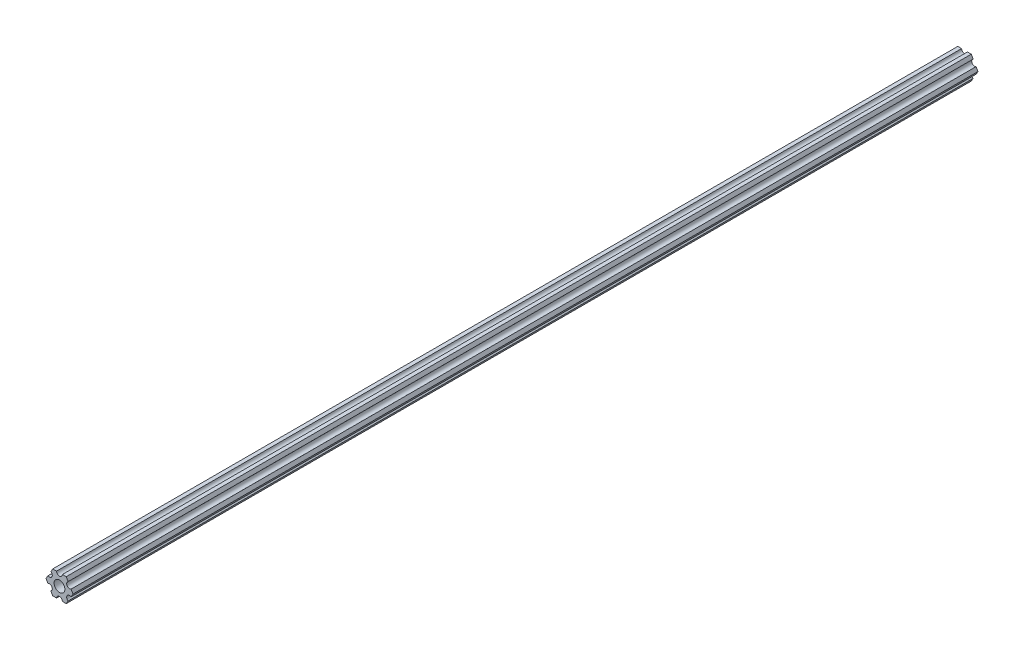
ISO-10303-21;
HEADER;
FILE_DESCRIPTION(('STEP AP214'),'2;1');
FILE_NAME('part.step','',(''),(''),'','','');
FILE_SCHEMA(('AUTOMOTIVE_DESIGN { 1 0 10303 214 1 1 1 1 }'));
ENDSEC;
DATA;
#1=APPLICATION_CONTEXT('core data for automotive mechanical design processes');
#2=APPLICATION_PROTOCOL_DEFINITION('international standard','automotive_design',2000,#1);
#3=PRODUCT_CONTEXT('',#1,'mechanical');
#4=PRODUCT('Part','Part','',(#3));
#5=PRODUCT_RELATED_PRODUCT_CATEGORY('part','',(#4));
#6=PRODUCT_DEFINITION_FORMATION('','',#4);
#7=PRODUCT_DEFINITION_CONTEXT('part definition',#1,'design');
#8=PRODUCT_DEFINITION('design','',#6,#7);
#9=PRODUCT_DEFINITION_SHAPE('','',#8);
#10=(LENGTH_UNIT() NAMED_UNIT(*) SI_UNIT(.MILLI.,.METRE.));
#11=(NAMED_UNIT(*) PLANE_ANGLE_UNIT() SI_UNIT($,.RADIAN.));
#12=(NAMED_UNIT(*) SI_UNIT($,.STERADIAN.) SOLID_ANGLE_UNIT());
#13=UNCERTAINTY_MEASURE_WITH_UNIT(LENGTH_MEASURE(1.E-05),#10,'distance_accuracy_value','');
#14=(GEOMETRIC_REPRESENTATION_CONTEXT(3) GLOBAL_UNCERTAINTY_ASSIGNED_CONTEXT((#13)) GLOBAL_UNIT_ASSIGNED_CONTEXT((#10,
#11,#12)) REPRESENTATION_CONTEXT('',''));
#15=CARTESIAN_POINT('',(0.,0.,0.));
#16=DIRECTION('',(0.,0.,1.));
#17=DIRECTION('',(1.,0.,0.));
#18=AXIS2_PLACEMENT_3D('',#15,#16,#17);
#19=CARTESIAN_POINT('',(6.29301142309098,-1.80018429024546,85.725));
#20=DIRECTION('',(-0.866025434075723,0.499999947533953,0.));
#21=DIRECTION('',(0.,0.,1.));
#22=AXIS2_PLACEMENT_3D('',#19,#20,#21);
#23=PLANE('',#22);
#24=DIRECTION('',(0.,0.,1.));
#25=VECTOR('',#24,1.);
#26=CARTESIAN_POINT('',(7.33234841870827,4.44212519169686E-07,85.725));
#27=LINE('',#26,#25);
#28=CARTESIAN_POINT('',(7.33234841870826,4.44212518961143E-07,-406.4));
#29=VERTEX_POINT('',#28);
#30=CARTESIAN_POINT('',(7.33234841870826,4.44212519315656E-07,85.725));
#31=VERTEX_POINT('',#30);
#32=EDGE_CURVE('E11',#29,#31,#27,.T.);
#33=ORIENTED_EDGE('',*,*,#32,.T.);
#34=DIRECTION('',(0.499999947533953,0.866025434075723,0.));
#35=VECTOR('',#34,1.);
#36=CARTESIAN_POINT('',(6.29301142309098,-1.80018429024546,85.725));
#37=LINE('',#36,#35);
#38=CARTESIAN_POINT('',(6.29301142309098,-1.80018429024546,85.725));
#39=VERTEX_POINT('',#38);
#40=EDGE_CURVE('E339',#39,#31,#37,.T.);
#41=ORIENTED_EDGE('',*,*,#40,.F.);
#42=DIRECTION('',(0.,0.,-1.));
#43=VECTOR('',#42,1.);
#44=CARTESIAN_POINT('',(6.29301142309098,-1.80018429024546,85.725));
#45=LINE('',#44,#43);
#46=CARTESIAN_POINT('',(6.29301142309098,-1.80018429024546,-406.4));
#47=VERTEX_POINT('',#46);
#48=EDGE_CURVE('E338',#39,#47,#45,.T.);
#49=ORIENTED_EDGE('',*,*,#48,.T.);
#50=DIRECTION('',(-0.499999947533953,-0.866025434075723,0.));
#51=VECTOR('',#50,1.);
#52=CARTESIAN_POINT('',(6.29301142309098,-1.80018429024546,-406.4));
#53=LINE('',#52,#51);
#54=EDGE_CURVE('E255',#29,#47,#53,.T.);
#55=ORIENTED_EDGE('',*,*,#54,.F.);
#56=EDGE_LOOP('',(#33,#41,#49,#55));
#57=FACE_BOUND('',#56,.T.);
#58=ADVANCED_FACE('F51',(#57),#23,.F.);
#59=CARTESIAN_POINT('',(7.33234841870827,4.44212519169686E-07,85.725));
#60=DIRECTION('',(-0.866025373493145,-0.500000052466057,0.));
#61=DIRECTION('',(-0.500000052466057,0.866025373493145,0.));
#62=AXIS2_PLACEMENT_3D('',#59,#60,#61);
#63=PLANE('',#62);
#64=DIRECTION('',(0.,0.,1.));
#65=VECTOR('',#64,1.);
#66=CARTESIAN_POINT('',(6.29301120497139,1.80018505273894,85.725));
#67=LINE('',#66,#65);
#68=CARTESIAN_POINT('',(6.29301120497139,1.80018505273894,-406.4));
#69=VERTEX_POINT('',#68);
#70=CARTESIAN_POINT('',(6.29301120497139,1.80018505273894,85.725));
#71=VERTEX_POINT('',#70);
#72=EDGE_CURVE('E60',#69,#71,#67,.T.);
#73=ORIENTED_EDGE('',*,*,#72,.T.);
#74=DIRECTION('',(-0.500000052466057,0.866025373493145,0.));
#75=VECTOR('',#74,1.);
#76=CARTESIAN_POINT('',(7.33234841870827,4.44212519198906E-07,85.725));
#77=LINE('',#76,#75);
#78=EDGE_CURVE('E343',#31,#71,#77,.T.);
#79=ORIENTED_EDGE('',*,*,#78,.F.);
#80=ORIENTED_EDGE('',*,*,#32,.F.);
#81=DIRECTION('',(0.500000052466055,-0.866025373493145,0.));
#82=VECTOR('',#81,1.);
#83=CARTESIAN_POINT('',(7.33234841870826,4.44212518961143E-07,-406.4));
#84=LINE('',#83,#82);
#85=EDGE_CURVE('E249',#69,#29,#84,.T.);
#86=ORIENTED_EDGE('',*,*,#85,.F.);
#87=EDGE_LOOP('',(#73,#79,#80,#86));
#88=FACE_BOUND('',#87,.T.);
#89=ADVANCED_FACE('F250',(#88),#63,.F.);
#90=CARTESIAN_POINT('',(4.70551103839172,4.54981561357972,85.725));
#91=DIRECTION('',(-0.866025373493151,-0.500000052466046,0.));
#92=DIRECTION('',(-0.500000052466046,0.866025373493151,0.));
#93=AXIS2_PLACEMENT_3D('',#90,#91,#92);
#94=PLANE('',#93);
#95=DIRECTION('',(0.,0.,1.));
#96=VECTOR('',#95,1.);
#97=CARTESIAN_POINT('',(3.66617382465481,6.35000022210627,85.725));
#98=LINE('',#97,#96);
#99=CARTESIAN_POINT('',(3.66617382465481,6.35000022210627,-406.4));
#100=VERTEX_POINT('',#99);
#101=CARTESIAN_POINT('',(3.66617382465481,6.35000022210627,85.725));
#102=VERTEX_POINT('',#101);
#103=EDGE_CURVE('E246',#100,#102,#98,.T.);
#104=ORIENTED_EDGE('',*,*,#103,.T.);
#105=DIRECTION('',(-0.500000052466046,0.866025373493151,0.));
#106=VECTOR('',#105,1.);
#107=CARTESIAN_POINT('',(4.70551103839172,4.54981561357972,85.725));
#108=LINE('',#107,#106);
#109=CARTESIAN_POINT('',(4.70551103839172,4.54981561357972,85.725));
#110=VERTEX_POINT('',#109);
#111=EDGE_CURVE('E386',#110,#102,#108,.T.);
#112=ORIENTED_EDGE('',*,*,#111,.F.);
#113=DIRECTION('',(0.,0.,1.));
#114=VECTOR('',#113,1.);
#115=CARTESIAN_POINT('',(4.70551103839172,4.54981561357972,85.725));
#116=LINE('',#115,#114);
#117=CARTESIAN_POINT('',(4.70551103839172,4.54981561357972,-406.4));
#118=VERTEX_POINT('',#117);
#119=EDGE_CURVE('E370',#118,#110,#116,.T.);
#120=ORIENTED_EDGE('',*,*,#119,.F.);
#121=DIRECTION('',(0.500000052466045,-0.866025373493151,0.));
#122=VECTOR('',#121,1.);
#123=CARTESIAN_POINT('',(4.70551103839172,4.54981561357972,-406.4));
#124=LINE('',#123,#122);
#125=EDGE_CURVE('E261',#100,#118,#124,.T.);
#126=ORIENTED_EDGE('',*,*,#125,.F.);
#127=EDGE_LOOP('',(#104,#112,#120,#126));
#128=FACE_BOUND('',#127,.T.);
#129=ADVANCED_FACE('F538',(#128),#94,.F.);
#130=CARTESIAN_POINT('',(3.66617382465481,6.35000022210627,85.725));
#131=DIRECTION('',(6.05825850611185E-08,-1.,0.));
#132=DIRECTION('',(0.,0.,-1.));
#133=AXIS2_PLACEMENT_3D('',#130,#131,#132);
#134=PLANE('',#133);
#135=DIRECTION('',(0.,0.,1.));
#136=VECTOR('',#135,1.);
#137=CARTESIAN_POINT('',(1.58749961530074,6.35000009617482,85.725));
#138=LINE('',#137,#136);
#139=CARTESIAN_POINT('',(1.58749961530073,6.35000015914054,-406.4));
#140=VERTEX_POINT('',#139);
#141=CARTESIAN_POINT('',(1.58749961530073,6.35000015914054,85.725));
#142=VERTEX_POINT('',#141);
#143=EDGE_CURVE('E381',#140,#142,#138,.T.);
#144=ORIENTED_EDGE('',*,*,#143,.T.);
#145=DIRECTION('',(-1.,0.,0.));
#146=VECTOR('',#145,1.);
#147=CARTESIAN_POINT('',(5.49926112168156,6.35000022210627,85.725));
#148=LINE('',#147,#146);
#149=EDGE_CURVE('E390',#102,#142,#148,.T.);
#150=ORIENTED_EDGE('',*,*,#149,.F.);
#151=ORIENTED_EDGE('',*,*,#103,.F.);
#152=DIRECTION('',(1.,3.02912931564594E-08,0.));
#153=VECTOR('',#152,1.);
#154=CARTESIAN_POINT('',(3.66617382465481,6.35000022210627,-406.4));
#155=LINE('',#154,#153);
#156=EDGE_CURVE('E323',#140,#100,#155,.T.);
#157=ORIENTED_EDGE('',*,*,#156,.F.);
#158=EDGE_LOOP('',(#144,#150,#151,#157));
#159=FACE_BOUND('',#158,.T.);
#160=ADVANCED_FACE('F536',(#159),#134,.F.);
#161=CARTESIAN_POINT('',(-3.84699260060323E-07,6.35,85.725));
#162=DIRECTION('',(0.,0.,-1.));
#163=DIRECTION('',(-1.,0.,0.));
#164=AXIS2_PLACEMENT_3D('',#161,#162,#163);
#165=CYLINDRICAL_SURFACE('',#164,1.5875);
#166=DIRECTION('',(0.,0.,1.));
#167=VECTOR('',#166,1.);
#168=CARTESIAN_POINT('',(-1.58750038469926,6.34999990382518,85.725));
#169=LINE('',#168,#167);
#170=CARTESIAN_POINT('',(-1.58750038469926,6.34999990382519,-406.4));
#171=VERTEX_POINT('',#170);
#172=CARTESIAN_POINT('',(-1.58750038469926,6.34999990382519,85.725));
#173=VERTEX_POINT('',#172);
#174=EDGE_CURVE('E378',#171,#173,#169,.T.);
#175=ORIENTED_EDGE('',*,*,#174,.T.);
#176=CARTESIAN_POINT('',(-3.84699260060323E-07,6.35,85.725));
#177=DIRECTION('',(0.,0.,-1.));
#178=DIRECTION('',(-1.,0.,0.));
#179=AXIS2_PLACEMENT_3D('',#176,#177,#178);
#180=CIRCLE('',#179,1.5875);
#181=EDGE_CURVE('E394',#142,#173,#180,.T.);
#182=ORIENTED_EDGE('',*,*,#181,.F.);
#183=ORIENTED_EDGE('',*,*,#143,.F.);
#184=CARTESIAN_POINT('',(-3.84699260060323E-07,6.35,-406.4));
#185=DIRECTION('',(0.,0.,1.));
#186=DIRECTION('',(-1.,0.,0.));
#187=AXIS2_PLACEMENT_3D('',#184,#185,#186);
#188=CIRCLE('',#187,1.5875);
#189=EDGE_CURVE('E319',#171,#140,#188,.T.);
#190=ORIENTED_EDGE('',*,*,#189,.F.);
#191=EDGE_LOOP('',(#175,#182,#183,#190));
#192=FACE_BOUND('',#191,.T.);
#193=ADVANCED_FACE('F532',(#192),#165,.F.);
#194=CARTESIAN_POINT('',(-1.58750038469926,6.34999990382518,85.725));
#195=DIRECTION('',(6.05825963273174E-08,-1.,0.));
#196=DIRECTION('',(0.,0.,-1.));
#197=AXIS2_PLACEMENT_3D('',#194,#195,#196);
#198=PLANE('',#197);
#199=DIRECTION('',(0.,0.,1.));
#200=VECTOR('',#199,1.);
#201=CARTESIAN_POINT('',(-3.66617459405349,6.3499997778937,85.725));
#202=LINE('',#201,#200);
#203=CARTESIAN_POINT('',(-3.66617454558244,6.34999986184803,-406.4));
#204=VERTEX_POINT('',#203);
#205=CARTESIAN_POINT('',(-3.66617454558244,6.34999986184803,85.725));
#206=VERTEX_POINT('',#205);
#207=EDGE_CURVE('E364',#204,#206,#202,.T.);
#208=ORIENTED_EDGE('',*,*,#207,.T.);
#209=DIRECTION('',(-1.,0.,0.));
#210=VECTOR('',#209,1.);
#211=CARTESIAN_POINT('',(5.49926112168156,6.34999990382519,85.725));
#212=LINE('',#211,#210);
#213=EDGE_CURVE('E398',#173,#206,#212,.T.);
#214=ORIENTED_EDGE('',*,*,#213,.F.);
#215=ORIENTED_EDGE('',*,*,#174,.F.);
#216=DIRECTION('',(1.,2.0194198968488E-08,0.));
#217=VECTOR('',#216,1.);
#218=CARTESIAN_POINT('',(-1.58750038469926,6.34999990382519,-406.4));
#219=LINE('',#218,#217);
#220=EDGE_CURVE('E315',#204,#171,#219,.T.);
#221=ORIENTED_EDGE('',*,*,#220,.F.);
#222=EDGE_LOOP('',(#208,#214,#215,#221));
#223=FACE_BOUND('',#222,.T.);
#224=ADVANCED_FACE('F528',(#223),#198,.F.);
#225=CARTESIAN_POINT('',(-3.66617459405349,6.3499997778937,85.725));
#226=DIRECTION('',(0.866025434075729,-0.499999947533942,0.));
#227=DIRECTION('',(0.,0.,-1.));
#228=AXIS2_PLACEMENT_3D('',#225,#226,#227);
#229=PLANE('',#228);
#230=DIRECTION('',(0.,0.,1.));
#231=VECTOR('',#230,1.);
#232=CARTESIAN_POINT('',(-4.70551158967065,4.54981504343587,85.725));
#233=LINE('',#232,#231);
#234=CARTESIAN_POINT('',(-4.70551158967065,4.54981504343587,-406.4));
#235=VERTEX_POINT('',#234);
#236=CARTESIAN_POINT('',(-4.70551158967065,4.54981504343587,85.725));
#237=VERTEX_POINT('',#236);
#238=EDGE_CURVE('E361',#235,#237,#233,.T.);
#239=ORIENTED_EDGE('',*,*,#238,.T.);
#240=DIRECTION('',(-0.499999947533943,-0.866025434075729,0.));
#241=VECTOR('',#240,1.);
#242=CARTESIAN_POINT('',(-3.66617459405349,6.3499997778937,85.725));
#243=LINE('',#242,#241);
#244=EDGE_CURVE('E402',#206,#237,#243,.T.);
#245=ORIENTED_EDGE('',*,*,#244,.F.);
#246=ORIENTED_EDGE('',*,*,#207,.F.);
#247=DIRECTION('',(0.499999947533939,0.866025434075731,0.));
#248=VECTOR('',#247,1.);
#249=CARTESIAN_POINT('',(-3.66617454558244,6.34999986184803,-406.4));
#250=LINE('',#249,#248);
#251=EDGE_CURVE('E311',#235,#204,#250,.T.);
#252=ORIENTED_EDGE('',*,*,#251,.F.);
#253=EDGE_LOOP('',(#239,#245,#246,#252));
#254=FACE_BOUND('',#253,.T.);
#255=ADVANCED_FACE('F524',(#254),#229,.F.);
#256=CARTESIAN_POINT('',(-5.49926150638082,3.17499966684067,85.725));
#257=DIRECTION('',(0.,0.,-1.));
#258=DIRECTION('',(-1.,0.,0.));
#259=AXIS2_PLACEMENT_3D('',#256,#257,#258);
#260=CYLINDRICAL_SURFACE('',#259,1.5875);
#261=DIRECTION('',(0.,0.,1.));
#262=VECTOR('',#261,1.);
#263=CARTESIAN_POINT('',(-6.29301142309098,1.80018429024547,85.725));
#264=LINE('',#263,#262);
#265=CARTESIAN_POINT('',(-6.29301142309098,1.80018429024546,-406.4));
#266=VERTEX_POINT('',#265);
#267=CARTESIAN_POINT('',(-6.29301142309098,1.80018429024547,85.725));
#268=VERTEX_POINT('',#267);
#269=EDGE_CURVE('E365',#266,#268,#264,.T.);
#270=ORIENTED_EDGE('',*,*,#269,.T.);
#271=CARTESIAN_POINT('',(-5.49926150638082,3.17499966684067,85.725));
#272=DIRECTION('',(0.,0.,-1.));
#273=DIRECTION('',(-1.,0.,0.));
#274=AXIS2_PLACEMENT_3D('',#271,#272,#273);
#275=CIRCLE('',#274,1.5875);
#276=EDGE_CURVE('E412',#237,#268,#275,.T.);
#277=ORIENTED_EDGE('',*,*,#276,.F.);
#278=ORIENTED_EDGE('',*,*,#238,.F.);
#279=CARTESIAN_POINT('',(-5.49926150638082,3.17499966684067,-406.4));
#280=DIRECTION('',(0.,0.,1.));
#281=DIRECTION('',(-1.,0.,0.));
#282=AXIS2_PLACEMENT_3D('',#279,#280,#281);
#283=CIRCLE('',#282,1.5875);
#284=EDGE_CURVE('E307',#266,#235,#283,.T.);
#285=ORIENTED_EDGE('',*,*,#284,.F.);
#286=EDGE_LOOP('',(#270,#277,#278,#285));
#287=FACE_BOUND('',#286,.T.);
#288=ADVANCED_FACE('F520',(#287),#260,.F.);
#289=CARTESIAN_POINT('',(-6.29301142309098,1.80018429024547,85.725));
#290=DIRECTION('',(0.866025434075724,-0.499999947533952,0.));
#291=DIRECTION('',(0.,0.,-1.));
#292=AXIS2_PLACEMENT_3D('',#289,#290,#291);
#293=PLANE('',#292);
#294=DIRECTION('',(0.,0.,1.));
#295=VECTOR('',#294,1.);
#296=CARTESIAN_POINT('',(-7.33234841870827,-4.44212523790841E-07,85.725));
#297=LINE('',#296,#295);
#298=CARTESIAN_POINT('',(-7.33234841870826,-4.44212524036367E-07,-406.4));
#299=VERTEX_POINT('',#298);
#300=CARTESIAN_POINT('',(-7.33234841870826,-4.44212524036367E-07,85.725));
#301=VERTEX_POINT('',#300);
#302=EDGE_CURVE('E358',#299,#301,#297,.T.);
#303=ORIENTED_EDGE('',*,*,#302,.T.);
#304=DIRECTION('',(-0.499999947533952,-0.866025434075724,0.));
#305=VECTOR('',#304,1.);
#306=CARTESIAN_POINT('',(-6.29301142309098,1.80018429024547,85.725));
#307=LINE('',#306,#305);
#308=EDGE_CURVE('E408',#268,#301,#307,.T.);
#309=ORIENTED_EDGE('',*,*,#308,.F.);
#310=ORIENTED_EDGE('',*,*,#269,.F.);
#311=DIRECTION('',(0.499999947533951,0.866025434075724,0.));
#312=VECTOR('',#311,1.);
#313=CARTESIAN_POINT('',(-6.29301142309098,1.80018429024547,-406.4));
#314=LINE('',#313,#312);
#315=EDGE_CURVE('E303',#299,#266,#314,.T.);
#316=ORIENTED_EDGE('',*,*,#315,.F.);
#317=EDGE_LOOP('',(#303,#309,#310,#316));
#318=FACE_BOUND('',#317,.T.);
#319=ADVANCED_FACE('F516',(#318),#293,.F.);
#320=CARTESIAN_POINT('',(-7.33234841870827,-4.44212523790841E-07,85.725));
#321=DIRECTION('',(0.866025373493151,0.500000052466045,0.));
#322=DIRECTION('',(0.,0.,-1.));
#323=AXIS2_PLACEMENT_3D('',#320,#321,#322);
#324=PLANE('',#323);
#325=DIRECTION('',(0.,0.,1.));
#326=VECTOR('',#325,1.);
#327=CARTESIAN_POINT('',(-6.29301120497141,-1.80018505273897,85.725));
#328=LINE('',#327,#326);
#329=CARTESIAN_POINT('',(-6.29301120497141,-1.80018505273897,-406.4));
#330=VERTEX_POINT('',#329);
#331=CARTESIAN_POINT('',(-6.29301120497141,-1.80018505273897,85.725));
#332=VERTEX_POINT('',#331);
#333=EDGE_CURVE('E348',#330,#332,#328,.T.);
#334=ORIENTED_EDGE('',*,*,#333,.T.);
#335=DIRECTION('',(0.500000052466045,-0.866025373493151,0.));
#336=VECTOR('',#335,1.);
#337=CARTESIAN_POINT('',(-7.33234841870827,-4.44212523969395E-07,85.725));
#338=LINE('',#337,#336);
#339=EDGE_CURVE('E403',#301,#332,#338,.T.);
#340=ORIENTED_EDGE('',*,*,#339,.F.);
#341=ORIENTED_EDGE('',*,*,#302,.F.);
#342=DIRECTION('',(-0.500000052466045,0.866025373493152,0.));
#343=VECTOR('',#342,1.);
#344=CARTESIAN_POINT('',(-7.33234841870826,-4.44212524036367E-07,-406.4));
#345=LINE('',#344,#343);
#346=EDGE_CURVE('E299',#330,#299,#345,.T.);
#347=ORIENTED_EDGE('',*,*,#346,.F.);
#348=EDGE_LOOP('',(#334,#340,#341,#347));
#349=FACE_BOUND('',#348,.T.);
#350=ADVANCED_FACE('F512',(#349),#324,.F.);
#351=CARTESIAN_POINT('',(-5.49926112168156,-3.17500033315934,85.725));
#352=DIRECTION('',(0.,0.,-1.));
#353=DIRECTION('',(-1.,0.,0.));
#354=AXIS2_PLACEMENT_3D('',#351,#352,#353);
#355=CYLINDRICAL_SURFACE('',#354,1.5875);
#356=DIRECTION('',(0.,0.,1.));
#357=VECTOR('',#356,1.);
#358=CARTESIAN_POINT('',(-4.70551103839172,-4.54981561357972,85.725));
#359=LINE('',#358,#357);
#360=CARTESIAN_POINT('',(-4.70551103839172,-4.54981561357972,-406.4));
#361=VERTEX_POINT('',#360);
#362=CARTESIAN_POINT('',(-4.70551103839172,-4.54981561357972,85.725));
#363=VERTEX_POINT('',#362);
#364=EDGE_CURVE('E345',#361,#363,#359,.T.);
#365=ORIENTED_EDGE('',*,*,#364,.T.);
#366=CARTESIAN_POINT('',(-5.49926112168156,-3.17500033315934,85.725));
#367=DIRECTION('',(0.,0.,-1.));
#368=DIRECTION('',(-1.,0.,0.));
#369=AXIS2_PLACEMENT_3D('',#366,#367,#368);
#370=CIRCLE('',#369,1.5875);
#371=EDGE_CURVE('E407',#332,#363,#370,.T.);
#372=ORIENTED_EDGE('',*,*,#371,.F.);
#373=ORIENTED_EDGE('',*,*,#333,.F.);
#374=CARTESIAN_POINT('',(-5.49926112168156,-3.17500033315934,-406.4));
#375=DIRECTION('',(0.,0.,1.));
#376=DIRECTION('',(-1.,0.,0.));
#377=AXIS2_PLACEMENT_3D('',#374,#375,#376);
#378=CIRCLE('',#377,1.5875);
#379=EDGE_CURVE('E295',#361,#330,#378,.T.);
#380=ORIENTED_EDGE('',*,*,#379,.F.);
#381=EDGE_LOOP('',(#365,#372,#373,#380));
#382=FACE_BOUND('',#381,.T.);
#383=ADVANCED_FACE('F508',(#382),#355,.F.);
#384=CARTESIAN_POINT('',(-4.70551103839172,-4.54981561357972,85.725));
#385=DIRECTION('',(0.866025373493152,0.500000052466045,0.));
#386=DIRECTION('',(0.,0.,-1.));
#387=AXIS2_PLACEMENT_3D('',#384,#385,#386);
#388=PLANE('',#387);
#389=DIRECTION('',(0.,0.,1.));
#390=VECTOR('',#389,1.);
#391=CARTESIAN_POINT('',(-3.66617382465481,-6.35000022210628,85.725));
#392=LINE('',#391,#390);
#393=CARTESIAN_POINT('',(-3.66617382465481,-6.35000022210628,-406.4));
#394=VERTEX_POINT('',#393);
#395=CARTESIAN_POINT('',(-3.66617382465481,-6.35000022210628,85.725));
#396=VERTEX_POINT('',#395);
#397=EDGE_CURVE('E349',#394,#396,#392,.T.);
#398=ORIENTED_EDGE('',*,*,#397,.T.);
#399=DIRECTION('',(0.500000052466045,-0.866025373493151,0.));
#400=VECTOR('',#399,1.);
#401=CARTESIAN_POINT('',(-4.70551103839172,-4.54981561357972,85.725));
#402=LINE('',#401,#400);
#403=EDGE_CURVE('E422',#363,#396,#402,.T.);
#404=ORIENTED_EDGE('',*,*,#403,.F.);
#405=ORIENTED_EDGE('',*,*,#364,.F.);
#406=DIRECTION('',(-0.500000052466043,0.866025373493152,0.));
#407=VECTOR('',#406,1.);
#408=CARTESIAN_POINT('',(-4.70551103839172,-4.54981561357972,-406.4));
#409=LINE('',#408,#407);
#410=EDGE_CURVE('E291',#394,#361,#409,.T.);
#411=ORIENTED_EDGE('',*,*,#410,.F.);
#412=EDGE_LOOP('',(#398,#404,#405,#411));
#413=FACE_BOUND('',#412,.T.);
#414=ADVANCED_FACE('F504',(#413),#388,.F.);
#415=CARTESIAN_POINT('',(-3.66617382465481,-6.35000022210628,85.725));
#416=DIRECTION('',(-6.05825854783851E-08,1.,0.));
#417=DIRECTION('',(0.,0.,1.));
#418=AXIS2_PLACEMENT_3D('',#415,#416,#417);
#419=PLANE('',#418);
#420=DIRECTION('',(0.,0.,1.));
#421=VECTOR('',#420,1.);
#422=CARTESIAN_POINT('',(-1.58749961530074,-6.35,85.725));
#423=LINE('',#422,#421);
#424=CARTESIAN_POINT('',(-1.58749961530073,-6.35000011105314,-406.4));
#425=VERTEX_POINT('',#424);
#426=CARTESIAN_POINT('',(-1.58749961530073,-6.35000011105314,85.725));
#427=VERTEX_POINT('',#426);
#428=EDGE_CURVE('E84',#425,#427,#423,.T.);
#429=ORIENTED_EDGE('',*,*,#428,.T.);
#430=DIRECTION('',(1.,0.,0.));
#431=VECTOR('',#430,1.);
#432=CARTESIAN_POINT('',(5.49926112168156,-6.35000022210628,85.725));
#433=LINE('',#432,#431);
#434=EDGE_CURVE('E426',#396,#427,#433,.T.);
#435=ORIENTED_EDGE('',*,*,#434,.F.);
#436=ORIENTED_EDGE('',*,*,#397,.F.);
#437=DIRECTION('',(-0.999999999999999,-5.34249856349036E-08,0.));
#438=VECTOR('',#437,1.);
#439=CARTESIAN_POINT('',(-3.66617382465481,-6.35000022210628,-406.4));
#440=LINE('',#439,#438);
#441=EDGE_CURVE('E287',#425,#394,#440,.T.);
#442=ORIENTED_EDGE('',*,*,#441,.F.);
#443=EDGE_LOOP('',(#429,#435,#436,#442));
#444=FACE_BOUND('',#443,.T.);
#445=ADVANCED_FACE('F501',(#444),#419,.F.);
#446=CARTESIAN_POINT('',(3.8469926204343E-07,-6.35,85.725));
#447=DIRECTION('',(0.,0.,-1.));
#448=DIRECTION('',(-1.,0.,0.));
#449=AXIS2_PLACEMENT_3D('',#446,#447,#448);
#450=CYLINDRICAL_SURFACE('',#449,1.5875);
#451=DIRECTION('',(0.,0.,1.));
#452=VECTOR('',#451,1.);
#453=CARTESIAN_POINT('',(1.58750038469926,-6.34999990382518,85.725));
#454=LINE('',#453,#452);
#455=CARTESIAN_POINT('',(1.58750038469926,-6.34999990382519,-406.4));
#456=VERTEX_POINT('',#455);
#457=CARTESIAN_POINT('',(1.58750038469926,-6.34999990382519,85.725));
#458=VERTEX_POINT('',#457);
#459=EDGE_CURVE('E73',#456,#458,#454,.T.);
#460=ORIENTED_EDGE('',*,*,#459,.T.);
#461=CARTESIAN_POINT('',(3.8469926204343E-07,-6.35,85.725));
#462=DIRECTION('',(0.,0.,-1.));
#463=DIRECTION('',(-1.,0.,0.));
#464=AXIS2_PLACEMENT_3D('',#461,#462,#463);
#465=CIRCLE('',#464,1.5875);
#466=EDGE_CURVE('E430',#427,#458,#465,.T.);
#467=ORIENTED_EDGE('',*,*,#466,.F.);
#468=ORIENTED_EDGE('',*,*,#428,.F.);
#469=CARTESIAN_POINT('',(3.8469926204343E-07,-6.35,-406.4));
#470=DIRECTION('',(0.,0.,1.));
#471=DIRECTION('',(-1.,0.,0.));
#472=AXIS2_PLACEMENT_3D('',#469,#470,#471);
#473=CIRCLE('',#472,1.5875);
#474=EDGE_CURVE('E283',#456,#425,#473,.T.);
#475=ORIENTED_EDGE('',*,*,#474,.F.);
#476=EDGE_LOOP('',(#460,#467,#468,#475));
#477=FACE_BOUND('',#476,.T.);
#478=ADVANCED_FACE('F499',(#477),#450,.F.);
#479=CARTESIAN_POINT('',(1.58750038469926,-6.34999990382518,85.725));
#480=DIRECTION('',(-6.05825721258438E-08,1.,0.));
#481=DIRECTION('',(0.,0.,1.));
#482=AXIS2_PLACEMENT_3D('',#479,#480,#481);
#483=PLANE('',#482);
#484=DIRECTION('',(0.,0.,1.));
#485=VECTOR('',#484,1.);
#486=CARTESIAN_POINT('',(3.66617459405346,-6.34999977789375,85.725));
#487=LINE('',#486,#485);
#488=CARTESIAN_POINT('',(3.66617454558244,-6.34999986184804,-406.4));
#489=VERTEX_POINT('',#488);
#490=CARTESIAN_POINT('',(3.66617454558244,-6.34999986184804,85.725));
#491=VERTEX_POINT('',#490);
#492=EDGE_CURVE('E431',#489,#491,#487,.T.);
#493=ORIENTED_EDGE('',*,*,#492,.T.);
#494=DIRECTION('',(1.,0.,0.));
#495=VECTOR('',#494,1.);
#496=CARTESIAN_POINT('',(5.49926112168156,-6.34999990382519,85.725));
#497=LINE('',#496,#495);
#498=EDGE_CURVE('E438',#458,#491,#497,.T.);
#499=ORIENTED_EDGE('',*,*,#498,.F.);
#500=ORIENTED_EDGE('',*,*,#459,.F.);
#501=DIRECTION('',(-1.,-2.01941943785532E-08,0.));
#502=VECTOR('',#501,1.);
#503=CARTESIAN_POINT('',(1.58750038469926,-6.34999990382519,-406.4));
#504=LINE('',#503,#502);
#505=EDGE_CURVE('E279',#489,#456,#504,.T.);
#506=ORIENTED_EDGE('',*,*,#505,.F.);
#507=EDGE_LOOP('',(#493,#499,#500,#506));
#508=FACE_BOUND('',#507,.T.);
#509=ADVANCED_FACE('F498',(#508),#483,.F.);
#510=CARTESIAN_POINT('',(3.66617459405346,-6.34999977789375,85.725));
#511=DIRECTION('',(-0.86602543407573,0.499999947533941,0.));
#512=DIRECTION('',(0.,0.,1.));
#513=AXIS2_PLACEMENT_3D('',#510,#511,#512);
#514=PLANE('',#513);
#515=DIRECTION('',(0.,0.,-1.));
#516=VECTOR('',#515,1.);
#517=CARTESIAN_POINT('',(4.70551158967065,-4.54981504343587,85.725));
#518=LINE('',#517,#516);
#519=CARTESIAN_POINT('',(4.70551158967065,-4.54981504343587,85.725));
#520=VERTEX_POINT('',#519);
#521=CARTESIAN_POINT('',(4.70551158967065,-4.54981504343587,-406.4));
#522=VERTEX_POINT('',#521);
#523=EDGE_CURVE('E434',#520,#522,#518,.T.);
#524=ORIENTED_EDGE('',*,*,#523,.F.);
#525=DIRECTION('',(0.49999994753394,0.86602543407573,0.));
#526=VECTOR('',#525,1.);
#527=CARTESIAN_POINT('',(3.66617459405346,-6.34999977789376,85.725));
#528=LINE('',#527,#526);
#529=EDGE_CURVE('E369',#491,#520,#528,.T.);
#530=ORIENTED_EDGE('',*,*,#529,.F.);
#531=ORIENTED_EDGE('',*,*,#492,.F.);
#532=DIRECTION('',(-0.499999947533941,-0.86602543407573,0.));
#533=VECTOR('',#532,1.);
#534=CARTESIAN_POINT('',(3.66617454558244,-6.34999986184804,-406.4));
#535=LINE('',#534,#533);
#536=EDGE_CURVE('E275',#522,#489,#535,.T.);
#537=ORIENTED_EDGE('',*,*,#536,.F.);
#538=EDGE_LOOP('',(#524,#530,#531,#537));
#539=FACE_BOUND('',#538,.T.);
#540=ADVANCED_FACE('F483',(#539),#514,.F.);
#541=CARTESIAN_POINT('',(5.49926112168156,3.17500033315934,85.725));
#542=DIRECTION('',(0.,0.,1.));
#543=DIRECTION('',(1.,0.,0.));
#544=AXIS2_PLACEMENT_3D('',#541,#542,#543);
#545=PLANE('',#544);
#546=CARTESIAN_POINT('',(0.,0.,85.725));
#547=DIRECTION('',(0.,0.,-1.));
#548=DIRECTION('',(-1.,0.,0.));
#549=AXIS2_PLACEMENT_3D('',#546,#547,#548);
#550=CIRCLE('',#549,2.9337);
#551=CARTESIAN_POINT('',(-2.9337,0.,85.725));
#552=VERTEX_POINT('',#551);
#553=CARTESIAN_POINT('',(2.9337,0.,85.725));
#554=VERTEX_POINT('',#553);
#555=EDGE_CURVE('E366',#552,#554,#550,.T.);
#556=ORIENTED_EDGE('',*,*,#555,.T.);
#557=CARTESIAN_POINT('',(0.,0.,85.725));
#558=DIRECTION('',(0.,0.,-1.));
#559=DIRECTION('',(-1.,0.,0.));
#560=AXIS2_PLACEMENT_3D('',#557,#558,#559);
#561=CIRCLE('',#560,2.9337);
#562=EDGE_CURVE('E328',#554,#552,#561,.T.);
#563=ORIENTED_EDGE('',*,*,#562,.T.);
#564=EDGE_LOOP('',(#556,#563));
#565=FACE_BOUND('',#564,.T.);
#566=ORIENTED_EDGE('',*,*,#529,.T.);
#567=CARTESIAN_POINT('',(5.49926150638082,-3.17499966684067,85.725));
#568=DIRECTION('',(0.,0.,-1.));
#569=DIRECTION('',(-1.,0.,0.));
#570=AXIS2_PLACEMENT_3D('',#567,#568,#569);
#571=CIRCLE('',#570,1.5875);
#572=CARTESIAN_POINT('',(3.91176150638082,-3.17499966684067,85.725));
#573=VERTEX_POINT('',#572);
#574=EDGE_CURVE('E344',#520,#573,#571,.T.);
#575=ORIENTED_EDGE('',*,*,#574,.T.);
#576=CARTESIAN_POINT('',(5.49926150638082,-3.17499966684067,85.725));
#577=DIRECTION('',(0.,0.,-1.));
#578=DIRECTION('',(-1.,0.,0.));
#579=AXIS2_PLACEMENT_3D('',#576,#577,#578);
#580=CIRCLE('',#579,1.5875);
#581=EDGE_CURVE('E350',#573,#39,#580,.T.);
#582=ORIENTED_EDGE('',*,*,#581,.T.);
#583=ORIENTED_EDGE('',*,*,#40,.T.);
#584=ORIENTED_EDGE('',*,*,#78,.T.);
#585=CARTESIAN_POINT('',(5.49926112168156,3.17500033315934,85.725));
#586=DIRECTION('',(0.,0.,-1.));
#587=DIRECTION('',(-1.,0.,0.));
#588=AXIS2_PLACEMENT_3D('',#585,#586,#587);
#589=CIRCLE('',#588,1.5875);
#590=CARTESIAN_POINT('',(3.91176112168156,3.17500033315934,85.725));
#591=VERTEX_POINT('',#590);
#592=EDGE_CURVE('E241',#71,#591,#589,.T.);
#593=ORIENTED_EDGE('',*,*,#592,.T.);
#594=CARTESIAN_POINT('',(5.49926112168156,3.17500033315934,85.725));
#595=DIRECTION('',(0.,0.,-1.));
#596=DIRECTION('',(-1.,0.,0.));
#597=AXIS2_PLACEMENT_3D('',#594,#595,#596);
#598=CIRCLE('',#597,1.5875);
#599=EDGE_CURVE('E333',#591,#110,#598,.T.);
#600=ORIENTED_EDGE('',*,*,#599,.T.);
#601=ORIENTED_EDGE('',*,*,#111,.T.);
#602=ORIENTED_EDGE('',*,*,#149,.T.);
#603=ORIENTED_EDGE('',*,*,#181,.T.);
#604=ORIENTED_EDGE('',*,*,#213,.T.);
#605=ORIENTED_EDGE('',*,*,#244,.T.);
#606=ORIENTED_EDGE('',*,*,#276,.T.);
#607=ORIENTED_EDGE('',*,*,#308,.T.);
#608=ORIENTED_EDGE('',*,*,#339,.T.);
#609=ORIENTED_EDGE('',*,*,#371,.T.);
#610=ORIENTED_EDGE('',*,*,#403,.T.);
#611=ORIENTED_EDGE('',*,*,#434,.T.);
#612=ORIENTED_EDGE('',*,*,#466,.T.);
#613=ORIENTED_EDGE('',*,*,#498,.T.);
#614=EDGE_LOOP('',(#566,#575,#582,#583,#584,#593,#600,#601,#602,#603,#604,#605,#606,#607,#608,
#609,#610,#611,#612,#613));
#615=FACE_BOUND('',#614,.T.);
#616=ADVANCED_FACE('F480',(#565,#615),#545,.T.);
#617=CARTESIAN_POINT('',(5.49926112168156,3.17500033315934,85.725));
#618=DIRECTION('',(0.,0.,-1.));
#619=DIRECTION('',(-1.,0.,0.));
#620=AXIS2_PLACEMENT_3D('',#617,#618,#619);
#621=CYLINDRICAL_SURFACE('',#620,1.5875);
#622=ORIENTED_EDGE('',*,*,#599,.F.);
#623=DIRECTION('',(0.,0.,-1.));
#624=VECTOR('',#623,1.);
#625=CARTESIAN_POINT('',(3.91176112168156,3.17500033315934,85.725));
#626=LINE('',#625,#624);
#627=CARTESIAN_POINT('',(3.91176112168156,3.17500033315934,0.));
#628=VERTEX_POINT('',#627);
#629=EDGE_CURVE('E337',#591,#628,#626,.T.);
#630=ORIENTED_EDGE('',*,*,#629,.T.);
#631=ORIENTED_EDGE('',*,*,#629,.F.);
#632=ORIENTED_EDGE('',*,*,#592,.F.);
#633=ORIENTED_EDGE('',*,*,#72,.F.);
#634=CARTESIAN_POINT('',(5.49926112168156,3.17500033315934,-406.4));
#635=DIRECTION('',(0.,0.,1.));
#636=DIRECTION('',(-1.,0.,0.));
#637=AXIS2_PLACEMENT_3D('',#634,#635,#636);
#638=CIRCLE('',#637,1.5875);
#639=EDGE_CURVE('E238',#118,#69,#638,.T.);
#640=ORIENTED_EDGE('',*,*,#639,.F.);
#641=ORIENTED_EDGE('',*,*,#119,.T.);
#642=EDGE_LOOP('',(#622,#630,#631,#632,#633,#640,#641));
#643=FACE_BOUND('',#642,.T.);
#644=ADVANCED_FACE('F235',(#643),#621,.F.);
#645=CARTESIAN_POINT('',(5.49926150638082,-3.17499966684067,85.725));
#646=DIRECTION('',(0.,0.,-1.));
#647=DIRECTION('',(-1.,0.,0.));
#648=AXIS2_PLACEMENT_3D('',#645,#646,#647);
#649=CYLINDRICAL_SURFACE('',#648,1.5875);
#650=ORIENTED_EDGE('',*,*,#581,.F.);
#651=DIRECTION('',(0.,0.,-1.));
#652=VECTOR('',#651,1.);
#653=CARTESIAN_POINT('',(3.91176150638082,-3.17499966684067,85.725));
#654=LINE('',#653,#652);
#655=CARTESIAN_POINT('',(3.91176150638082,-3.17499966684067,0.));
#656=VERTEX_POINT('',#655);
#657=EDGE_CURVE('E354',#573,#656,#654,.T.);
#658=ORIENTED_EDGE('',*,*,#657,.T.);
#659=ORIENTED_EDGE('',*,*,#657,.F.);
#660=ORIENTED_EDGE('',*,*,#574,.F.);
#661=ORIENTED_EDGE('',*,*,#523,.T.);
#662=CARTESIAN_POINT('',(5.49926150638082,-3.17499966684067,-406.4));
#663=DIRECTION('',(0.,0.,1.));
#664=DIRECTION('',(-1.,0.,0.));
#665=AXIS2_PLACEMENT_3D('',#662,#663,#664);
#666=CIRCLE('',#665,1.5875);
#667=EDGE_CURVE('E271',#47,#522,#666,.T.);
#668=ORIENTED_EDGE('',*,*,#667,.F.);
#669=ORIENTED_EDGE('',*,*,#48,.F.);
#670=EDGE_LOOP('',(#650,#658,#659,#660,#661,#668,#669));
#671=FACE_BOUND('',#670,.T.);
#672=ADVANCED_FACE('F493',(#671),#649,.F.);
#673=CARTESIAN_POINT('',(0.,0.,85.725));
#674=DIRECTION('',(0.,0.,-1.));
#675=DIRECTION('',(-1.,0.,0.));
#676=AXIS2_PLACEMENT_3D('',#673,#674,#675);
#677=CYLINDRICAL_SURFACE('',#676,2.9337);
#678=ORIENTED_EDGE('',*,*,#562,.F.);
#679=DIRECTION('',(0.,0.,-1.));
#680=VECTOR('',#679,1.);
#681=CARTESIAN_POINT('',(2.9337,0.,85.725));
#682=LINE('',#681,#680);
#683=CARTESIAN_POINT('',(2.9337,0.,0.));
#684=VERTEX_POINT('',#683);
#685=EDGE_CURVE('E332',#554,#684,#682,.T.);
#686=ORIENTED_EDGE('',*,*,#685,.T.);
#687=ORIENTED_EDGE('',*,*,#685,.F.);
#688=ORIENTED_EDGE('',*,*,#555,.F.);
#689=DIRECTION('',(0.,0.,-1.));
#690=VECTOR('',#689,1.);
#691=CARTESIAN_POINT('',(-2.9337,0.,85.725));
#692=LINE('',#691,#690);
#693=CARTESIAN_POINT('',(-2.9337,0.,0.));
#694=VERTEX_POINT('',#693);
#695=EDGE_CURVE('E355',#552,#694,#692,.T.);
#696=ORIENTED_EDGE('',*,*,#695,.T.);
#697=ORIENTED_EDGE('',*,*,#695,.F.);
#698=EDGE_LOOP('',(#678,#686,#687,#688,#696,#697));
#699=FACE_BOUND('',#698,.T.);
#700=CARTESIAN_POINT('',(0.,0.,-406.4));
#701=DIRECTION('',(0.,0.,-1.));
#702=DIRECTION('',(-1.,0.,0.));
#703=AXIS2_PLACEMENT_3D('',#700,#701,#702);
#704=CIRCLE('',#703,2.9337);
#705=CARTESIAN_POINT('',(-2.9337,0.,-406.4));
#706=VERTEX_POINT('',#705);
#707=EDGE_CURVE('E263',#706,#706,#704,.T.);
#708=ORIENTED_EDGE('',*,*,#707,.T.);
#709=EDGE_LOOP('',(#708));
#710=FACE_BOUND('',#709,.T.);
#711=ADVANCED_FACE('F476',(#699,#710),#677,.F.);
#712=CARTESIAN_POINT('',(5.49926112168156,3.17500033315934,-406.4));
#713=DIRECTION('',(0.,0.,-1.));
#714=DIRECTION('',(-1.,0.,0.));
#715=AXIS2_PLACEMENT_3D('',#712,#713,#714);
#716=PLANE('',#715);
#717=ORIENTED_EDGE('',*,*,#639,.T.);
#718=ORIENTED_EDGE('',*,*,#85,.T.);
#719=ORIENTED_EDGE('',*,*,#54,.T.);
#720=ORIENTED_EDGE('',*,*,#667,.T.);
#721=ORIENTED_EDGE('',*,*,#536,.T.);
#722=ORIENTED_EDGE('',*,*,#505,.T.);
#723=ORIENTED_EDGE('',*,*,#474,.T.);
#724=ORIENTED_EDGE('',*,*,#441,.T.);
#725=ORIENTED_EDGE('',*,*,#410,.T.);
#726=ORIENTED_EDGE('',*,*,#379,.T.);
#727=ORIENTED_EDGE('',*,*,#346,.T.);
#728=ORIENTED_EDGE('',*,*,#315,.T.);
#729=ORIENTED_EDGE('',*,*,#284,.T.);
#730=ORIENTED_EDGE('',*,*,#251,.T.);
#731=ORIENTED_EDGE('',*,*,#220,.T.);
#732=ORIENTED_EDGE('',*,*,#189,.T.);
#733=ORIENTED_EDGE('',*,*,#156,.T.);
#734=ORIENTED_EDGE('',*,*,#125,.T.);
#735=EDGE_LOOP('',(#717,#718,#719,#720,#721,#722,#723,#724,#725,#726,#727,#728,#729,#730,#731,
#732,#733,#734));
#736=FACE_BOUND('',#735,.T.);
#737=ORIENTED_EDGE('',*,*,#707,.F.);
#738=EDGE_LOOP('',(#737));
#739=FACE_BOUND('',#738,.T.);
#740=ADVANCED_FACE('F257',(#736,#739),#716,.T.);
#741=CLOSED_SHELL('',(#58,#89,#129,#160,#193,#224,#255,#288,#319,#350,#383,#414,#445,#478,#509,
#540,#616,#644,#672,#711,#740));
#742=MANIFOLD_SOLID_BREP('B2',#741);
#743=ADVANCED_BREP_SHAPE_REPRESENTATION('',(#18,#742),#14);
#744=SHAPE_DEFINITION_REPRESENTATION(#9,#743);
ENDSEC;
END-ISO-10303-21;
